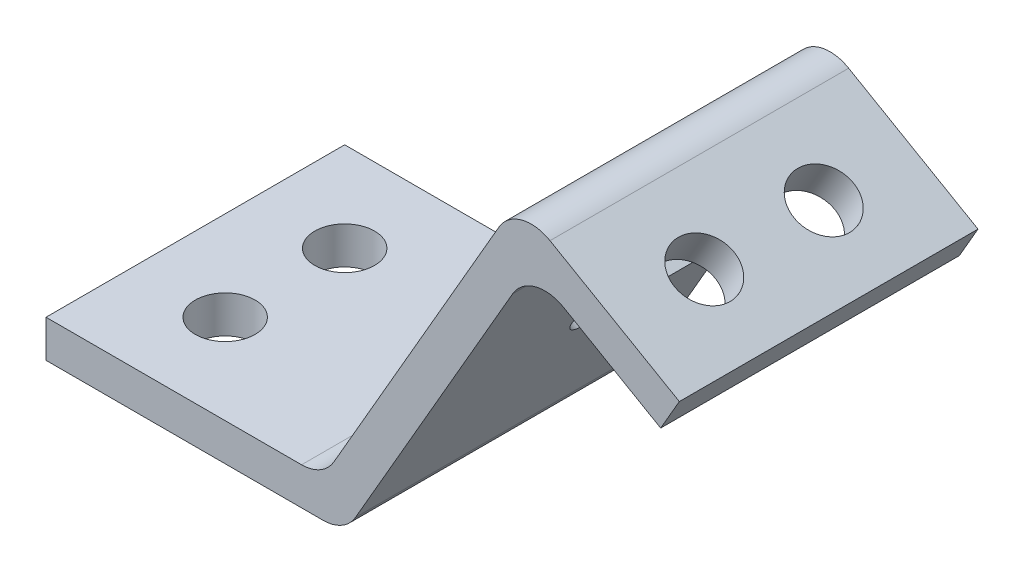
ISO-10303-21;
HEADER;
FILE_DESCRIPTION(('STEP AP214'),'2;1');
FILE_NAME('part.step','',(''),(''),'','','');
FILE_SCHEMA(('AUTOMOTIVE_DESIGN { 1 0 10303 214 1 1 1 1 }'));
ENDSEC;
DATA;
#1=APPLICATION_CONTEXT('core data for automotive mechanical design processes');
#2=APPLICATION_PROTOCOL_DEFINITION('international standard','automotive_design',2000,#1);
#3=PRODUCT_CONTEXT('',#1,'mechanical');
#4=PRODUCT('Part','Part','',(#3));
#5=PRODUCT_RELATED_PRODUCT_CATEGORY('part','',(#4));
#6=PRODUCT_DEFINITION_FORMATION('','',#4);
#7=PRODUCT_DEFINITION_CONTEXT('part definition',#1,'design');
#8=PRODUCT_DEFINITION('design','',#6,#7);
#9=PRODUCT_DEFINITION_SHAPE('','',#8);
#10=(LENGTH_UNIT() NAMED_UNIT(*) SI_UNIT(.MILLI.,.METRE.));
#11=(NAMED_UNIT(*) PLANE_ANGLE_UNIT() SI_UNIT($,.RADIAN.));
#12=(NAMED_UNIT(*) SI_UNIT($,.STERADIAN.) SOLID_ANGLE_UNIT());
#13=UNCERTAINTY_MEASURE_WITH_UNIT(LENGTH_MEASURE(1.E-05),#10,'distance_accuracy_value','');
#14=(GEOMETRIC_REPRESENTATION_CONTEXT(3) GLOBAL_UNCERTAINTY_ASSIGNED_CONTEXT((#13)) GLOBAL_UNIT_ASSIGNED_CONTEXT((#10,
#11,#12)) REPRESENTATION_CONTEXT('',''));
#15=CARTESIAN_POINT('',(0.,0.,0.));
#16=DIRECTION('',(0.,0.,1.));
#17=DIRECTION('',(1.,0.,0.));
#18=AXIS2_PLACEMENT_3D('',#15,#16,#17);
#19=CARTESIAN_POINT('',(34.2264973081042,10.,0.));
#20=DIRECTION('',(0.,0.,1.));
#21=DIRECTION('',(1.,0.,0.));
#22=AXIS2_PLACEMENT_3D('',#19,#20,#21);
#23=PLANE('',#22);
#24=DIRECTION('',(-0.499999999999998,-0.86602540378444,0.));
#25=VECTOR('',#24,1.);
#26=CARTESIAN_POINT('',(38.5566243270263,7.50000000000001,0.));
#27=LINE('',#26,#25);
#28=CARTESIAN_POINT('',(46.6698729810782,21.5525588832578,0.));
#29=VERTEX_POINT('',#28);
#30=CARTESIAN_POINT('',(38.5566243270263,7.50000000000001,0.));
#31=VERTEX_POINT('',#30);
#32=EDGE_CURVE('E191',#29,#31,#27,.T.);
#33=ORIENTED_EDGE('',*,*,#32,.F.);
#34=DIRECTION('',(-0.86602540378444,0.499999999999998,0.));
#35=VECTOR('',#34,1.);
#36=CARTESIAN_POINT('',(84.616564069469,-0.355973431480049,0.));
#37=LINE('',#36,#35);
#38=CARTESIAN_POINT('',(51.0000000000004,19.0525588832578,0.));
#39=VERTEX_POINT('',#38);
#40=EDGE_CURVE('E282',#39,#29,#37,.T.);
#41=ORIENTED_EDGE('',*,*,#40,.F.);
#42=DIRECTION('',(0.499999999999998,0.86602540378444,0.));
#43=VECTOR('',#42,1.);
#44=CARTESIAN_POINT('',(41.4433756729745,2.50000000000001,0.));
#45=LINE('',#44,#43);
#46=CARTESIAN_POINT('',(41.4433756729745,2.50000000000001,0.));
#47=VERTEX_POINT('',#46);
#48=EDGE_CURVE('E179',#47,#39,#45,.T.);
#49=ORIENTED_EDGE('',*,*,#48,.F.);
#50=CARTESIAN_POINT('',(37.1132486540523,5.,0.));
#51=DIRECTION('',(0.,0.,1.));
#52=DIRECTION('',(1.,0.,0.));
#53=AXIS2_PLACEMENT_3D('',#50,#51,#52);
#54=CIRCLE('',#53,5.);
#55=CARTESIAN_POINT('',(37.1132486540523,0.,0.));
#56=VERTEX_POINT('',#55);
#57=EDGE_CURVE('E176',#56,#47,#54,.T.);
#58=ORIENTED_EDGE('',*,*,#57,.F.);
#59=DIRECTION('',(1.,0.,0.));
#60=VECTOR('',#59,1.);
#61=CARTESIAN_POINT('',(0.,0.,0.));
#62=LINE('',#61,#60);
#63=CARTESIAN_POINT('',(0.,0.,0.));
#64=VERTEX_POINT('',#63);
#65=EDGE_CURVE('E174',#64,#56,#62,.T.);
#66=ORIENTED_EDGE('',*,*,#65,.F.);
#67=DIRECTION('',(0.,-1.,0.));
#68=VECTOR('',#67,1.);
#69=CARTESIAN_POINT('',(0.,5.,0.));
#70=LINE('',#69,#68);
#71=CARTESIAN_POINT('',(0.,5.,0.));
#72=VERTEX_POINT('',#71);
#73=EDGE_CURVE('E172',#72,#64,#70,.T.);
#74=ORIENTED_EDGE('',*,*,#73,.F.);
#75=DIRECTION('',(-1.,0.,0.));
#76=VECTOR('',#75,1.);
#77=CARTESIAN_POINT('',(0.,5.,0.));
#78=LINE('',#77,#76);
#79=CARTESIAN_POINT('',(34.2264973081041,5.00000000000001,0.));
#80=VERTEX_POINT('',#79);
#81=EDGE_CURVE('E169',#80,#72,#78,.T.);
#82=ORIENTED_EDGE('',*,*,#81,.F.);
#83=CARTESIAN_POINT('',(34.2264973081042,10.,0.));
#84=DIRECTION('',(0.,0.,-1.));
#85=DIRECTION('',(1.,0.,0.));
#86=AXIS2_PLACEMENT_3D('',#83,#84,#85);
#87=CIRCLE('',#86,4.99999999999998);
#88=EDGE_CURVE('E104',#31,#80,#87,.T.);
#89=ORIENTED_EDGE('',*,*,#88,.F.);
#90=EDGE_LOOP('',(#33,#41,#49,#58,#66,#74,#82,#89));
#91=FACE_BOUND('',#90,.T.);
#92=ADVANCED_FACE('F33',(#91),#23,.F.);
#93=CARTESIAN_POINT('',(0.,5.,40.));
#94=DIRECTION('',(0.,-1.,0.));
#95=DIRECTION('',(0.,0.,-1.));
#96=AXIS2_PLACEMENT_3D('',#93,#94,#95);
#97=PLANE('',#96);
#98=CARTESIAN_POINT('',(12.,5.,12.));
#99=DIRECTION('',(0.,1.,0.));
#100=DIRECTION('',(0.,0.,1.));
#101=AXIS2_PLACEMENT_3D('',#98,#99,#100);
#102=CIRCLE('',#101,4.);
#103=CARTESIAN_POINT('',(12.,5.,16.));
#104=VERTEX_POINT('',#103);
#105=EDGE_CURVE('E220',#104,#104,#102,.T.);
#106=ORIENTED_EDGE('',*,*,#105,.F.);
#107=EDGE_LOOP('',(#106));
#108=FACE_BOUND('',#107,.T.);
#109=CARTESIAN_POINT('',(12.,5.,28.));
#110=DIRECTION('',(0.,1.,0.));
#111=DIRECTION('',(0.,0.,1.));
#112=AXIS2_PLACEMENT_3D('',#109,#110,#111);
#113=CIRCLE('',#112,4.);
#114=CARTESIAN_POINT('',(12.,5.,32.));
#115=VERTEX_POINT('',#114);
#116=EDGE_CURVE('E225',#115,#115,#113,.T.);
#117=ORIENTED_EDGE('',*,*,#116,.F.);
#118=EDGE_LOOP('',(#117));
#119=FACE_BOUND('',#118,.T.);
#120=ORIENTED_EDGE('',*,*,#81,.T.);
#121=DIRECTION('',(0.,0.,-1.));
#122=VECTOR('',#121,1.);
#123=CARTESIAN_POINT('',(0.,5.,40.));
#124=LINE('',#123,#122);
#125=CARTESIAN_POINT('',(0.,5.,40.));
#126=VERTEX_POINT('',#125);
#127=EDGE_CURVE('E11',#126,#72,#124,.T.);
#128=ORIENTED_EDGE('',*,*,#127,.F.);
#129=DIRECTION('',(-1.,0.,0.));
#130=VECTOR('',#129,1.);
#131=CARTESIAN_POINT('',(0.,5.,40.));
#132=LINE('',#131,#130);
#133=CARTESIAN_POINT('',(34.2264973081041,5.00000000000001,40.));
#134=VERTEX_POINT('',#133);
#135=EDGE_CURVE('E195',#134,#126,#132,.T.);
#136=ORIENTED_EDGE('',*,*,#135,.F.);
#137=DIRECTION('',(0.,0.,-1.));
#138=VECTOR('',#137,1.);
#139=CARTESIAN_POINT('',(34.2264973081041,5.00000000000001,40.));
#140=LINE('',#139,#138);
#141=EDGE_CURVE('E165',#134,#80,#140,.T.);
#142=ORIENTED_EDGE('',*,*,#141,.T.);
#143=EDGE_LOOP('',(#120,#128,#136,#142));
#144=FACE_BOUND('',#143,.T.);
#145=ADVANCED_FACE('F35',(#108,#119,#144),#97,.F.);
#146=CARTESIAN_POINT('',(0.,5.,40.));
#147=DIRECTION('',(1.,0.,0.));
#148=DIRECTION('',(0.,0.,-1.));
#149=AXIS2_PLACEMENT_3D('',#146,#147,#148);
#150=PLANE('',#149);
#151=ORIENTED_EDGE('',*,*,#73,.T.);
#152=DIRECTION('',(0.,0.,-1.));
#153=VECTOR('',#152,1.);
#154=CARTESIAN_POINT('',(0.,0.,40.));
#155=LINE('',#154,#153);
#156=CARTESIAN_POINT('',(0.,0.,40.));
#157=VERTEX_POINT('',#156);
#158=EDGE_CURVE('E42',#157,#64,#155,.T.);
#159=ORIENTED_EDGE('',*,*,#158,.F.);
#160=DIRECTION('',(0.,-1.,0.));
#161=VECTOR('',#160,1.);
#162=CARTESIAN_POINT('',(0.,5.,40.));
#163=LINE('',#162,#161);
#164=EDGE_CURVE('E112',#126,#157,#163,.T.);
#165=ORIENTED_EDGE('',*,*,#164,.F.);
#166=ORIENTED_EDGE('',*,*,#127,.T.);
#167=EDGE_LOOP('',(#151,#159,#165,#166));
#168=FACE_BOUND('',#167,.T.);
#169=ADVANCED_FACE('F326',(#168),#150,.F.);
#170=CARTESIAN_POINT('',(0.,0.,40.));
#171=DIRECTION('',(0.,1.,0.));
#172=DIRECTION('',(0.,0.,1.));
#173=AXIS2_PLACEMENT_3D('',#170,#171,#172);
#174=PLANE('',#173);
#175=CARTESIAN_POINT('',(12.,0.,12.));
#176=DIRECTION('',(0.,1.,0.));
#177=DIRECTION('',(0.,0.,1.));
#178=AXIS2_PLACEMENT_3D('',#175,#176,#177);
#179=CIRCLE('',#178,4.);
#180=CARTESIAN_POINT('',(12.,0.,16.));
#181=VERTEX_POINT('',#180);
#182=EDGE_CURVE('E37',#181,#181,#179,.T.);
#183=ORIENTED_EDGE('',*,*,#182,.T.);
#184=EDGE_LOOP('',(#183));
#185=FACE_BOUND('',#184,.T.);
#186=CARTESIAN_POINT('',(12.,0.,28.));
#187=DIRECTION('',(0.,1.,0.));
#188=DIRECTION('',(0.,0.,1.));
#189=AXIS2_PLACEMENT_3D('',#186,#187,#188);
#190=CIRCLE('',#189,4.);
#191=CARTESIAN_POINT('',(12.,0.,32.));
#192=VERTEX_POINT('',#191);
#193=EDGE_CURVE('E218',#192,#192,#190,.T.);
#194=ORIENTED_EDGE('',*,*,#193,.T.);
#195=EDGE_LOOP('',(#194));
#196=FACE_BOUND('',#195,.T.);
#197=ORIENTED_EDGE('',*,*,#65,.T.);
#198=DIRECTION('',(0.,0.,-1.));
#199=VECTOR('',#198,1.);
#200=CARTESIAN_POINT('',(37.1132486540523,0.,40.));
#201=LINE('',#200,#199);
#202=CARTESIAN_POINT('',(37.1132486540523,0.,40.));
#203=VERTEX_POINT('',#202);
#204=EDGE_CURVE('E214',#203,#56,#201,.T.);
#205=ORIENTED_EDGE('',*,*,#204,.F.);
#206=DIRECTION('',(1.,0.,0.));
#207=VECTOR('',#206,1.);
#208=CARTESIAN_POINT('',(0.,0.,40.));
#209=LINE('',#208,#207);
#210=EDGE_CURVE('E237',#157,#203,#209,.T.);
#211=ORIENTED_EDGE('',*,*,#210,.F.);
#212=ORIENTED_EDGE('',*,*,#158,.T.);
#213=EDGE_LOOP('',(#197,#205,#211,#212));
#214=FACE_BOUND('',#213,.T.);
#215=ADVANCED_FACE('F385',(#185,#196,#214),#174,.F.);
#216=CARTESIAN_POINT('',(37.1132486540523,5.,40.));
#217=DIRECTION('',(0.,0.,-1.));
#218=DIRECTION('',(-1.,0.,0.));
#219=AXIS2_PLACEMENT_3D('',#216,#217,#218);
#220=CYLINDRICAL_SURFACE('',#219,5.);
#221=ORIENTED_EDGE('',*,*,#57,.T.);
#222=DIRECTION('',(0.,0.,-1.));
#223=VECTOR('',#222,1.);
#224=CARTESIAN_POINT('',(41.4433756729745,2.50000000000001,40.));
#225=LINE('',#224,#223);
#226=CARTESIAN_POINT('',(41.4433756729745,2.50000000000001,40.));
#227=VERTEX_POINT('',#226);
#228=EDGE_CURVE('E211',#227,#47,#225,.T.);
#229=ORIENTED_EDGE('',*,*,#228,.F.);
#230=CARTESIAN_POINT('',(37.1132486540523,5.,40.));
#231=DIRECTION('',(0.,0.,1.));
#232=DIRECTION('',(1.,0.,0.));
#233=AXIS2_PLACEMENT_3D('',#230,#231,#232);
#234=CIRCLE('',#233,5.);
#235=EDGE_CURVE('E239',#203,#227,#234,.T.);
#236=ORIENTED_EDGE('',*,*,#235,.F.);
#237=ORIENTED_EDGE('',*,*,#204,.T.);
#238=EDGE_LOOP('',(#221,#229,#236,#237));
#239=FACE_BOUND('',#238,.T.);
#240=ADVANCED_FACE('F380',(#239),#220,.T.);
#241=CARTESIAN_POINT('',(41.4433756729745,2.50000000000001,40.));
#242=DIRECTION('',(-0.86602540378444,0.499999999999998,0.));
#243=DIRECTION('',(-0.499999999999998,-0.86602540378444,0.));
#244=AXIS2_PLACEMENT_3D('',#241,#242,#243);
#245=PLANE('',#244);
#246=ORIENTED_EDGE('',*,*,#48,.T.);
#247=DIRECTION('',(0.,0.,-1.));
#248=VECTOR('',#247,1.);
#249=CARTESIAN_POINT('',(51.0000000000004,19.0525588832578,19.));
#250=LINE('',#249,#248);
#251=CARTESIAN_POINT('',(51.0000000000004,19.0525588832578,19.));
#252=VERTEX_POINT('',#251);
#253=EDGE_CURVE('E275',#252,#39,#250,.T.);
#254=ORIENTED_EDGE('',*,*,#253,.F.);
#255=CARTESIAN_POINT('',(52.5000000000004,21.6506350946111,19.));
#256=DIRECTION('',(-0.86602540378444,0.499999999999998,0.));
#257=DIRECTION('',(-0.499999999999998,-0.86602540378444,0.));
#258=AXIS2_PLACEMENT_3D('',#255,#256,#257);
#259=CIRCLE('',#258,3.);
#260=CARTESIAN_POINT('',(54.0000000000004,24.2487113059645,19.));
#261=VERTEX_POINT('',#260);
#262=EDGE_CURVE('E294',#261,#252,#259,.F.);
#263=ORIENTED_EDGE('',*,*,#262,.F.);
#264=DIRECTION('',(0.,0.,1.));
#265=VECTOR('',#264,1.);
#266=CARTESIAN_POINT('',(54.0000000000004,24.2487113059645,19.));
#267=LINE('',#266,#265);
#268=CARTESIAN_POINT('',(54.0000000000004,24.2487113059645,0.));
#269=VERTEX_POINT('',#268);
#270=EDGE_CURVE('E230',#269,#261,#267,.T.);
#271=ORIENTED_EDGE('',*,*,#270,.F.);
#272=CARTESIAN_POINT('',(62.5000000000003,38.9711431702998,0.));
#273=VERTEX_POINT('',#272);
#274=EDGE_CURVE('E178',#269,#273,#45,.T.);
#275=ORIENTED_EDGE('',*,*,#274,.T.);
#276=DIRECTION('',(0.,0.,-1.));
#277=VECTOR('',#276,1.);
#278=CARTESIAN_POINT('',(62.5000000000003,38.9711431702998,40.));
#279=LINE('',#278,#277);
#280=CARTESIAN_POINT('',(62.5000000000003,38.9711431702998,40.));
#281=VERTEX_POINT('',#280);
#282=EDGE_CURVE('E208',#281,#273,#279,.T.);
#283=ORIENTED_EDGE('',*,*,#282,.F.);
#284=DIRECTION('',(0.499999999999998,0.86602540378444,0.));
#285=VECTOR('',#284,1.);
#286=CARTESIAN_POINT('',(41.4433756729745,2.50000000000001,40.));
#287=LINE('',#286,#285);
#288=EDGE_CURVE('E241',#227,#281,#287,.T.);
#289=ORIENTED_EDGE('',*,*,#288,.F.);
#290=ORIENTED_EDGE('',*,*,#228,.T.);
#291=EDGE_LOOP('',(#246,#254,#263,#271,#275,#283,#289,#290));
#292=FACE_BOUND('',#291,.T.);
#293=ADVANCED_FACE('F375',(#292),#245,.F.);
#294=CARTESIAN_POINT('',(66.8301270189225,36.4711431702998,40.));
#295=DIRECTION('',(0.,0.,-1.));
#296=DIRECTION('',(-1.,0.,0.));
#297=AXIS2_PLACEMENT_3D('',#294,#295,#296);
#298=CYLINDRICAL_SURFACE('',#297,5.);
#299=CARTESIAN_POINT('',(66.8301270189225,36.4711431702998,0.));
#300=DIRECTION('',(0.,0.,-1.));
#301=DIRECTION('',(1.,0.,0.));
#302=AXIS2_PLACEMENT_3D('',#299,#300,#301);
#303=CIRCLE('',#302,5.);
#304=CARTESIAN_POINT('',(69.3301270189225,40.8012701892221,0.));
#305=VERTEX_POINT('',#304);
#306=EDGE_CURVE('E182',#273,#305,#303,.T.);
#307=ORIENTED_EDGE('',*,*,#306,.T.);
#308=DIRECTION('',(0.,0.,-1.));
#309=VECTOR('',#308,1.);
#310=CARTESIAN_POINT('',(69.3301270189225,40.8012701892221,40.));
#311=LINE('',#310,#309);
#312=CARTESIAN_POINT('',(69.3301270189225,40.8012701892221,40.));
#313=VERTEX_POINT('',#312);
#314=EDGE_CURVE('E205',#313,#305,#311,.T.);
#315=ORIENTED_EDGE('',*,*,#314,.F.);
#316=CARTESIAN_POINT('',(66.8301270189225,36.4711431702998,40.));
#317=DIRECTION('',(0.,0.,-1.));
#318=DIRECTION('',(1.,0.,0.));
#319=AXIS2_PLACEMENT_3D('',#316,#317,#318);
#320=CIRCLE('',#319,5.);
#321=EDGE_CURVE('E243',#281,#313,#320,.T.);
#322=ORIENTED_EDGE('',*,*,#321,.F.);
#323=ORIENTED_EDGE('',*,*,#282,.T.);
#324=EDGE_LOOP('',(#307,#315,#322,#323));
#325=FACE_BOUND('',#324,.T.);
#326=ADVANCED_FACE('F397',(#325),#298,.F.);
#327=CARTESIAN_POINT('',(82.3205080756892,33.3012701892222,40.));
#328=DIRECTION('',(0.499999999999992,0.866025403784443,0.));
#329=DIRECTION('',(-0.866025403784443,0.499999999999992,0.));
#330=AXIS2_PLACEMENT_3D('',#327,#328,#329);
#331=PLANE('',#330);
#332=CARTESIAN_POINT('',(73.6602540378448,38.301270189222,28.));
#333=DIRECTION('',(0.499999999999992,0.866025403784443,0.));
#334=DIRECTION('',(-0.866025403784443,0.499999999999992,0.));
#335=AXIS2_PLACEMENT_3D('',#332,#333,#334);
#336=CIRCLE('',#335,4.00000000000001);
#337=CARTESIAN_POINT('',(70.196152422707,40.301270189222,28.));
#338=VERTEX_POINT('',#337);
#339=EDGE_CURVE('E363',#338,#338,#336,.F.);
#340=ORIENTED_EDGE('',*,*,#339,.F.);
#341=EDGE_LOOP('',(#340));
#342=FACE_BOUND('',#341,.T.);
#343=CARTESIAN_POINT('',(73.6602540378448,38.301270189222,12.));
#344=DIRECTION('',(0.499999999999992,0.866025403784443,0.));
#345=DIRECTION('',(-0.866025403784443,0.499999999999992,0.));
#346=AXIS2_PLACEMENT_3D('',#343,#344,#345);
#347=CIRCLE('',#346,4.00000000000001);
#348=CARTESIAN_POINT('',(70.196152422707,40.301270189222,12.));
#349=VERTEX_POINT('',#348);
#350=EDGE_CURVE('E367',#349,#349,#347,.F.);
#351=ORIENTED_EDGE('',*,*,#350,.F.);
#352=EDGE_LOOP('',(#351));
#353=FACE_BOUND('',#352,.T.);
#354=DIRECTION('',(0.866025403784443,-0.499999999999992,0.));
#355=VECTOR('',#354,1.);
#356=CARTESIAN_POINT('',(82.3205080756892,33.3012701892222,0.));
#357=LINE('',#356,#355);
#358=CARTESIAN_POINT('',(82.3205080756892,33.3012701892222,0.));
#359=VERTEX_POINT('',#358);
#360=EDGE_CURVE('E184',#305,#359,#357,.T.);
#361=ORIENTED_EDGE('',*,*,#360,.T.);
#362=DIRECTION('',(0.,0.,-1.));
#363=VECTOR('',#362,1.);
#364=CARTESIAN_POINT('',(82.3205080756892,33.3012701892222,40.));
#365=LINE('',#364,#363);
#366=CARTESIAN_POINT('',(82.3205080756892,33.3012701892222,40.));
#367=VERTEX_POINT('',#366);
#368=EDGE_CURVE('E202',#367,#359,#365,.T.);
#369=ORIENTED_EDGE('',*,*,#368,.F.);
#370=DIRECTION('',(0.866025403784443,-0.499999999999992,0.));
#371=VECTOR('',#370,1.);
#372=CARTESIAN_POINT('',(82.3205080756892,33.3012701892222,40.));
#373=LINE('',#372,#371);
#374=EDGE_CURVE('E245',#313,#367,#373,.T.);
#375=ORIENTED_EDGE('',*,*,#374,.F.);
#376=ORIENTED_EDGE('',*,*,#314,.T.);
#377=EDGE_LOOP('',(#361,#369,#375,#376));
#378=FACE_BOUND('',#377,.T.);
#379=ADVANCED_FACE('F400',(#342,#353,#378),#331,.F.);
#380=CARTESIAN_POINT('',(84.8205080756891,37.6313972081443,40.));
#381=DIRECTION('',(-0.86602540378444,0.499999999999998,0.));
#382=DIRECTION('',(-0.499999999999998,-0.86602540378444,0.));
#383=AXIS2_PLACEMENT_3D('',#380,#381,#382);
#384=PLANE('',#383);
#385=DIRECTION('',(0.499999999999998,0.86602540378444,0.));
#386=VECTOR('',#385,1.);
#387=CARTESIAN_POINT('',(84.8205080756891,37.6313972081443,0.));
#388=LINE('',#387,#386);
#389=CARTESIAN_POINT('',(84.8205080756891,37.6313972081443,0.));
#390=VERTEX_POINT('',#389);
#391=EDGE_CURVE('E186',#359,#390,#388,.T.);
#392=ORIENTED_EDGE('',*,*,#391,.T.);
#393=DIRECTION('',(0.,0.,-1.));
#394=VECTOR('',#393,1.);
#395=CARTESIAN_POINT('',(84.8205080756891,37.6313972081443,40.));
#396=LINE('',#395,#394);
#397=CARTESIAN_POINT('',(84.8205080756891,37.6313972081443,40.));
#398=VERTEX_POINT('',#397);
#399=EDGE_CURVE('E199',#398,#390,#396,.T.);
#400=ORIENTED_EDGE('',*,*,#399,.F.);
#401=DIRECTION('',(0.499999999999998,0.86602540378444,0.));
#402=VECTOR('',#401,1.);
#403=CARTESIAN_POINT('',(84.8205080756891,37.6313972081443,40.));
#404=LINE('',#403,#402);
#405=EDGE_CURVE('E247',#367,#398,#404,.T.);
#406=ORIENTED_EDGE('',*,*,#405,.F.);
#407=ORIENTED_EDGE('',*,*,#368,.T.);
#408=EDGE_LOOP('',(#392,#400,#406,#407));
#409=FACE_BOUND('',#408,.T.);
#410=ADVANCED_FACE('F253',(#409),#384,.F.);
#411=CARTESIAN_POINT('',(67.5000000000003,47.6313972081442,40.));
#412=DIRECTION('',(-0.499999999999993,-0.866025403784443,0.));
#413=DIRECTION('',(0.866025403784443,-0.499999999999993,0.));
#414=AXIS2_PLACEMENT_3D('',#411,#412,#413);
#415=PLANE('',#414);
#416=CARTESIAN_POINT('',(76.1602540378448,42.6313972081443,28.));
#417=DIRECTION('',(0.499999999999993,0.866025403784443,0.));
#418=DIRECTION('',(-0.866025403784443,0.499999999999993,0.));
#419=AXIS2_PLACEMENT_3D('',#416,#417,#418);
#420=CIRCLE('',#419,4.00000000000001);
#421=CARTESIAN_POINT('',(72.696152422707,44.6313972081443,28.));
#422=VERTEX_POINT('',#421);
#423=EDGE_CURVE('E360',#422,#422,#420,.T.);
#424=ORIENTED_EDGE('',*,*,#423,.F.);
#425=EDGE_LOOP('',(#424));
#426=FACE_BOUND('',#425,.T.);
#427=CARTESIAN_POINT('',(76.1602540378448,42.6313972081443,12.));
#428=DIRECTION('',(0.499999999999993,0.866025403784443,0.));
#429=DIRECTION('',(-0.866025403784443,0.499999999999993,0.));
#430=AXIS2_PLACEMENT_3D('',#427,#428,#429);
#431=CIRCLE('',#430,4.00000000000001);
#432=CARTESIAN_POINT('',(72.696152422707,44.6313972081443,12.));
#433=VERTEX_POINT('',#432);
#434=EDGE_CURVE('E370',#433,#433,#431,.T.);
#435=ORIENTED_EDGE('',*,*,#434,.F.);
#436=EDGE_LOOP('',(#435));
#437=FACE_BOUND('',#436,.T.);
#438=DIRECTION('',(-0.866025403784443,0.499999999999993,0.));
#439=VECTOR('',#438,1.);
#440=CARTESIAN_POINT('',(67.5000000000003,47.6313972081442,0.));
#441=LINE('',#440,#439);
#442=CARTESIAN_POINT('',(67.5000000000003,47.6313972081442,0.));
#443=VERTEX_POINT('',#442);
#444=EDGE_CURVE('E188',#390,#443,#441,.T.);
#445=ORIENTED_EDGE('',*,*,#444,.T.);
#446=DIRECTION('',(0.,0.,-1.));
#447=VECTOR('',#446,1.);
#448=CARTESIAN_POINT('',(67.5000000000003,47.6313972081442,40.));
#449=LINE('',#448,#447);
#450=CARTESIAN_POINT('',(67.5000000000003,47.6313972081442,40.));
#451=VERTEX_POINT('',#450);
#452=EDGE_CURVE('E159',#451,#443,#449,.T.);
#453=ORIENTED_EDGE('',*,*,#452,.F.);
#454=DIRECTION('',(-0.866025403784443,0.499999999999993,0.));
#455=VECTOR('',#454,1.);
#456=CARTESIAN_POINT('',(67.5000000000003,47.6313972081442,40.));
#457=LINE('',#456,#455);
#458=EDGE_CURVE('E146',#398,#451,#457,.T.);
#459=ORIENTED_EDGE('',*,*,#458,.F.);
#460=ORIENTED_EDGE('',*,*,#399,.T.);
#461=EDGE_LOOP('',(#445,#453,#459,#460));
#462=FACE_BOUND('',#461,.T.);
#463=ADVANCED_FACE('F257',(#426,#437,#462),#415,.F.);
#464=CARTESIAN_POINT('',(65.0000000000003,43.301270189222,40.));
#465=DIRECTION('',(0.,0.,-1.));
#466=DIRECTION('',(-1.,0.,0.));
#467=AXIS2_PLACEMENT_3D('',#464,#465,#466);
#468=CYLINDRICAL_SURFACE('',#467,5.00000000000001);
#469=CARTESIAN_POINT('',(65.0000000000003,43.301270189222,0.));
#470=DIRECTION('',(0.,0.,1.));
#471=DIRECTION('',(1.,0.,0.));
#472=AXIS2_PLACEMENT_3D('',#469,#470,#471);
#473=CIRCLE('',#472,5.00000000000001);
#474=CARTESIAN_POINT('',(60.6698729810781,45.801270189222,0.));
#475=VERTEX_POINT('',#474);
#476=EDGE_CURVE('E155',#443,#475,#473,.T.);
#477=ORIENTED_EDGE('',*,*,#476,.T.);
#478=DIRECTION('',(0.,0.,-1.));
#479=VECTOR('',#478,1.);
#480=CARTESIAN_POINT('',(60.6698729810781,45.801270189222,40.));
#481=LINE('',#480,#479);
#482=CARTESIAN_POINT('',(60.6698729810781,45.801270189222,40.));
#483=VERTEX_POINT('',#482);
#484=EDGE_CURVE('E152',#483,#475,#481,.T.);
#485=ORIENTED_EDGE('',*,*,#484,.F.);
#486=CARTESIAN_POINT('',(65.0000000000003,43.301270189222,40.));
#487=DIRECTION('',(0.,0.,1.));
#488=DIRECTION('',(1.,0.,0.));
#489=AXIS2_PLACEMENT_3D('',#486,#487,#488);
#490=CIRCLE('',#489,5.00000000000001);
#491=EDGE_CURVE('E139',#451,#483,#490,.T.);
#492=ORIENTED_EDGE('',*,*,#491,.F.);
#493=ORIENTED_EDGE('',*,*,#452,.T.);
#494=EDGE_LOOP('',(#477,#485,#492,#493));
#495=FACE_BOUND('',#494,.T.);
#496=ADVANCED_FACE('F153',(#495),#468,.T.);
#497=CARTESIAN_POINT('',(38.5566243270263,7.50000000000001,40.));
#498=DIRECTION('',(0.86602540378444,-0.499999999999998,0.));
#499=DIRECTION('',(0.499999999999998,0.86602540378444,0.));
#500=AXIS2_PLACEMENT_3D('',#497,#498,#499);
#501=PLANE('',#500);
#502=CARTESIAN_POINT('',(48.1698729810782,24.1506350946111,19.));
#503=DIRECTION('',(-0.86602540378444,0.499999999999998,0.));
#504=DIRECTION('',(-0.499999999999998,-0.86602540378444,0.));
#505=AXIS2_PLACEMENT_3D('',#502,#503,#504);
#506=CIRCLE('',#505,3.);
#507=CARTESIAN_POINT('',(46.6698729810782,21.5525588832578,19.));
#508=VERTEX_POINT('',#507);
#509=CARTESIAN_POINT('',(49.6698729810782,26.7487113059644,19.));
#510=VERTEX_POINT('',#509);
#511=EDGE_CURVE('E266',#508,#510,#506,.T.);
#512=ORIENTED_EDGE('',*,*,#511,.F.);
#513=DIRECTION('',(0.,0.,1.));
#514=VECTOR('',#513,1.);
#515=CARTESIAN_POINT('',(46.6698729810782,21.5525588832578,19.));
#516=LINE('',#515,#514);
#517=EDGE_CURVE('E270',#29,#508,#516,.T.);
#518=ORIENTED_EDGE('',*,*,#517,.F.);
#519=ORIENTED_EDGE('',*,*,#32,.T.);
#520=DIRECTION('',(0.,0.,-1.));
#521=VECTOR('',#520,1.);
#522=CARTESIAN_POINT('',(38.5566243270263,7.50000000000001,40.));
#523=LINE('',#522,#521);
#524=CARTESIAN_POINT('',(38.5566243270263,7.50000000000001,40.));
#525=VERTEX_POINT('',#524);
#526=EDGE_CURVE('E160',#525,#31,#523,.T.);
#527=ORIENTED_EDGE('',*,*,#526,.F.);
#528=DIRECTION('',(-0.499999999999998,-0.86602540378444,0.));
#529=VECTOR('',#528,1.);
#530=CARTESIAN_POINT('',(38.5566243270263,7.50000000000001,40.));
#531=LINE('',#530,#529);
#532=EDGE_CURVE('E143',#483,#525,#531,.T.);
#533=ORIENTED_EDGE('',*,*,#532,.F.);
#534=ORIENTED_EDGE('',*,*,#484,.T.);
#535=CARTESIAN_POINT('',(49.6698729810782,26.7487113059645,0.));
#536=VERTEX_POINT('',#535);
#537=EDGE_CURVE('E192',#475,#536,#27,.T.);
#538=ORIENTED_EDGE('',*,*,#537,.T.);
#539=DIRECTION('',(0.,0.,-1.));
#540=VECTOR('',#539,1.);
#541=CARTESIAN_POINT('',(49.6698729810782,26.7487113059644,19.));
#542=LINE('',#541,#540);
#543=EDGE_CURVE('E50',#510,#536,#542,.T.);
#544=ORIENTED_EDGE('',*,*,#543,.F.);
#545=EDGE_LOOP('',(#512,#518,#519,#527,#533,#534,#538,#544));
#546=FACE_BOUND('',#545,.T.);
#547=ADVANCED_FACE('F163',(#546),#501,.F.);
#548=CARTESIAN_POINT('',(34.2264973081042,10.,40.));
#549=DIRECTION('',(0.,0.,-1.));
#550=DIRECTION('',(-1.,0.,0.));
#551=AXIS2_PLACEMENT_3D('',#548,#549,#550);
#552=CYLINDRICAL_SURFACE('',#551,4.99999999999998);
#553=ORIENTED_EDGE('',*,*,#88,.T.);
#554=ORIENTED_EDGE('',*,*,#141,.F.);
#555=CARTESIAN_POINT('',(34.2264973081042,10.,40.));
#556=DIRECTION('',(0.,0.,-1.));
#557=DIRECTION('',(1.,0.,0.));
#558=AXIS2_PLACEMENT_3D('',#555,#556,#557);
#559=CIRCLE('',#558,4.99999999999998);
#560=EDGE_CURVE('E59',#525,#134,#559,.T.);
#561=ORIENTED_EDGE('',*,*,#560,.F.);
#562=ORIENTED_EDGE('',*,*,#526,.T.);
#563=EDGE_LOOP('',(#553,#554,#561,#562));
#564=FACE_BOUND('',#563,.T.);
#565=ADVANCED_FACE('F312',(#564),#552,.F.);
#566=CARTESIAN_POINT('',(34.2264973081042,10.,40.));
#567=DIRECTION('',(0.,0.,1.));
#568=DIRECTION('',(1.,0.,0.));
#569=AXIS2_PLACEMENT_3D('',#566,#567,#568);
#570=PLANE('',#569);
#571=ORIENTED_EDGE('',*,*,#135,.T.);
#572=ORIENTED_EDGE('',*,*,#164,.T.);
#573=ORIENTED_EDGE('',*,*,#210,.T.);
#574=ORIENTED_EDGE('',*,*,#235,.T.);
#575=ORIENTED_EDGE('',*,*,#288,.T.);
#576=ORIENTED_EDGE('',*,*,#321,.T.);
#577=ORIENTED_EDGE('',*,*,#374,.T.);
#578=ORIENTED_EDGE('',*,*,#405,.T.);
#579=ORIENTED_EDGE('',*,*,#458,.T.);
#580=ORIENTED_EDGE('',*,*,#491,.T.);
#581=ORIENTED_EDGE('',*,*,#532,.T.);
#582=ORIENTED_EDGE('',*,*,#560,.T.);
#583=EDGE_LOOP('',(#571,#572,#573,#574,#575,#576,#577,#578,#579,#580,#581,#582));
#584=FACE_BOUND('',#583,.T.);
#585=ADVANCED_FACE('F141',(#584),#570,.T.);
#586=ORIENTED_EDGE('',*,*,#274,.F.);
#587=DIRECTION('',(-0.86602540378444,0.499999999999998,0.));
#588=VECTOR('',#587,1.);
#589=CARTESIAN_POINT('',(87.616564069469,4.84017899122659,0.));
#590=LINE('',#589,#588);
#591=EDGE_CURVE('E261',#269,#536,#590,.T.);
#592=ORIENTED_EDGE('',*,*,#591,.T.);
#593=ORIENTED_EDGE('',*,*,#537,.F.);
#594=ORIENTED_EDGE('',*,*,#476,.F.);
#595=ORIENTED_EDGE('',*,*,#444,.F.);
#596=ORIENTED_EDGE('',*,*,#391,.F.);
#597=ORIENTED_EDGE('',*,*,#360,.F.);
#598=ORIENTED_EDGE('',*,*,#306,.F.);
#599=EDGE_LOOP('',(#586,#592,#593,#594,#595,#596,#597,#598));
#600=FACE_BOUND('',#599,.T.);
#601=ADVANCED_FACE('F260',(#600),#23,.F.);
#602=CARTESIAN_POINT('',(12.,-35.,28.));
#603=DIRECTION('',(0.,1.,0.));
#604=DIRECTION('',(0.,0.,1.));
#605=AXIS2_PLACEMENT_3D('',#602,#603,#604);
#606=CYLINDRICAL_SURFACE('',#605,4.);
#607=ORIENTED_EDGE('',*,*,#116,.T.);
#608=EDGE_LOOP('',(#607));
#609=FACE_BOUND('',#608,.T.);
#610=ORIENTED_EDGE('',*,*,#193,.F.);
#611=EDGE_LOOP('',(#610));
#612=FACE_BOUND('',#611,.T.);
#613=ADVANCED_FACE('F329',(#609,#612),#606,.F.);
#614=CARTESIAN_POINT('',(12.,-35.,12.));
#615=DIRECTION('',(0.,1.,0.));
#616=DIRECTION('',(0.,0.,1.));
#617=AXIS2_PLACEMENT_3D('',#614,#615,#616);
#618=CYLINDRICAL_SURFACE('',#617,4.);
#619=ORIENTED_EDGE('',*,*,#105,.T.);
#620=EDGE_LOOP('',(#619));
#621=FACE_BOUND('',#620,.T.);
#622=ORIENTED_EDGE('',*,*,#182,.F.);
#623=EDGE_LOOP('',(#622));
#624=FACE_BOUND('',#623,.T.);
#625=ADVANCED_FACE('F333',(#621,#624),#618,.F.);
#626=CARTESIAN_POINT('',(86.116564069469,2.24210277987327,19.));
#627=DIRECTION('',(-0.86602540378444,0.499999999999998,0.));
#628=DIRECTION('',(-0.499999999999998,-0.86602540378444,0.));
#629=AXIS2_PLACEMENT_3D('',#626,#627,#628);
#630=CYLINDRICAL_SURFACE('',#629,3.);
#631=ORIENTED_EDGE('',*,*,#262,.T.);
#632=DIRECTION('',(-0.86602540378444,0.499999999999998,0.));
#633=VECTOR('',#632,1.);
#634=CARTESIAN_POINT('',(84.616564069469,-0.355973431480049,19.));
#635=LINE('',#634,#633);
#636=EDGE_CURVE('E279',#252,#508,#635,.T.);
#637=ORIENTED_EDGE('',*,*,#636,.T.);
#638=ORIENTED_EDGE('',*,*,#511,.T.);
#639=DIRECTION('',(-0.86602540378444,0.499999999999998,0.));
#640=VECTOR('',#639,1.);
#641=CARTESIAN_POINT('',(87.616564069469,4.84017899122659,19.));
#642=LINE('',#641,#640);
#643=EDGE_CURVE('E273',#261,#510,#642,.T.);
#644=ORIENTED_EDGE('',*,*,#643,.F.);
#645=EDGE_LOOP('',(#631,#637,#638,#644));
#646=FACE_BOUND('',#645,.T.);
#647=ADVANCED_FACE('F292',(#646),#630,.F.);
#648=CARTESIAN_POINT('',(84.616564069469,-0.355973431480049,19.));
#649=DIRECTION('',(-0.499999999999998,-0.86602540378444,0.));
#650=DIRECTION('',(0.86602540378444,-0.499999999999998,0.));
#651=AXIS2_PLACEMENT_3D('',#648,#649,#650);
#652=PLANE('',#651);
#653=ORIENTED_EDGE('',*,*,#253,.T.);
#654=ORIENTED_EDGE('',*,*,#40,.T.);
#655=ORIENTED_EDGE('',*,*,#517,.T.);
#656=ORIENTED_EDGE('',*,*,#636,.F.);
#657=EDGE_LOOP('',(#653,#654,#655,#656));
#658=FACE_BOUND('',#657,.T.);
#659=ADVANCED_FACE('F300',(#658),#652,.F.);
#660=CARTESIAN_POINT('',(87.616564069469,4.84017899122659,19.));
#661=DIRECTION('',(0.499999999999998,0.86602540378444,0.));
#662=DIRECTION('',(-0.86602540378444,0.499999999999998,0.));
#663=AXIS2_PLACEMENT_3D('',#660,#661,#662);
#664=PLANE('',#663);
#665=ORIENTED_EDGE('',*,*,#270,.T.);
#666=ORIENTED_EDGE('',*,*,#643,.T.);
#667=ORIENTED_EDGE('',*,*,#543,.T.);
#668=ORIENTED_EDGE('',*,*,#591,.F.);
#669=EDGE_LOOP('',(#665,#666,#667,#668));
#670=FACE_BOUND('',#669,.T.);
#671=ADVANCED_FACE('F287',(#670),#664,.F.);
#672=CARTESIAN_POINT('',(38.6595710251434,-22.3216910883908,12.));
#673=DIRECTION('',(0.499999999999993,0.866025403784443,0.));
#674=DIRECTION('',(-0.866025403784443,0.499999999999993,0.));
#675=AXIS2_PLACEMENT_3D('',#672,#673,#674);
#676=CYLINDRICAL_SURFACE('',#675,4.00000000000001);
#677=ORIENTED_EDGE('',*,*,#434,.T.);
#678=EDGE_LOOP('',(#677));
#679=FACE_BOUND('',#678,.T.);
#680=ORIENTED_EDGE('',*,*,#350,.T.);
#681=EDGE_LOOP('',(#680));
#682=FACE_BOUND('',#681,.T.);
#683=ADVANCED_FACE('F346',(#679,#682),#676,.F.);
#684=CARTESIAN_POINT('',(38.6595710251434,-22.3216910883908,28.));
#685=DIRECTION('',(0.499999999999993,0.866025403784443,0.));
#686=DIRECTION('',(-0.866025403784443,0.499999999999993,0.));
#687=AXIS2_PLACEMENT_3D('',#684,#685,#686);
#688=CYLINDRICAL_SURFACE('',#687,4.00000000000001);
#689=ORIENTED_EDGE('',*,*,#423,.T.);
#690=EDGE_LOOP('',(#689));
#691=FACE_BOUND('',#690,.T.);
#692=ORIENTED_EDGE('',*,*,#339,.T.);
#693=EDGE_LOOP('',(#692));
#694=FACE_BOUND('',#693,.T.);
#695=ADVANCED_FACE('F351',(#691,#694),#688,.F.);
#696=CLOSED_SHELL('',(#92,#145,#169,#215,#240,#293,#326,#379,#410,#463,#496,#547,#565,#585,#601,
#613,#625,#647,#659,#671,#683,#695));
#697=MANIFOLD_SOLID_BREP('B2',#696);
#698=ADVANCED_BREP_SHAPE_REPRESENTATION('',(#18,#697),#14);
#699=SHAPE_DEFINITION_REPRESENTATION(#9,#698);
ENDSEC;
END-ISO-10303-21;
